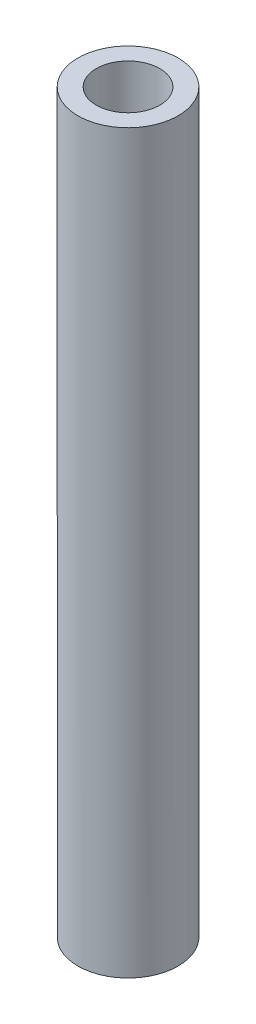
ISO-10303-21;
HEADER;
FILE_DESCRIPTION(('STEP AP214'),'2;1');
FILE_NAME('part.step','',(''),(''),'','','');
FILE_SCHEMA(('AUTOMOTIVE_DESIGN { 1 0 10303 214 1 1 1 1 }'));
ENDSEC;
DATA;
#1=APPLICATION_CONTEXT('core data for automotive mechanical design processes');
#2=APPLICATION_PROTOCOL_DEFINITION('international standard','automotive_design',2000,#1);
#3=PRODUCT_CONTEXT('',#1,'mechanical');
#4=PRODUCT('Part','Part','',(#3));
#5=PRODUCT_RELATED_PRODUCT_CATEGORY('part','',(#4));
#6=PRODUCT_DEFINITION_FORMATION('','',#4);
#7=PRODUCT_DEFINITION_CONTEXT('part definition',#1,'design');
#8=PRODUCT_DEFINITION('design','',#6,#7);
#9=PRODUCT_DEFINITION_SHAPE('','',#8);
#10=(LENGTH_UNIT() NAMED_UNIT(*) SI_UNIT(.MILLI.,.METRE.));
#11=(NAMED_UNIT(*) PLANE_ANGLE_UNIT() SI_UNIT($,.RADIAN.));
#12=(NAMED_UNIT(*) SI_UNIT($,.STERADIAN.) SOLID_ANGLE_UNIT());
#13=UNCERTAINTY_MEASURE_WITH_UNIT(LENGTH_MEASURE(1.E-05),#10,'distance_accuracy_value','');
#14=(GEOMETRIC_REPRESENTATION_CONTEXT(3) GLOBAL_UNCERTAINTY_ASSIGNED_CONTEXT((#13)) GLOBAL_UNIT_ASSIGNED_CONTEXT((#10,
#11,#12)) REPRESENTATION_CONTEXT('',''));
#15=CARTESIAN_POINT('',(0.,0.,0.));
#16=DIRECTION('',(0.,0.,1.));
#17=DIRECTION('',(1.,0.,0.));
#18=AXIS2_PLACEMENT_3D('',#15,#16,#17);
#19=CARTESIAN_POINT('',(0.,-65.,0.));
#20=DIRECTION('',(0.,1.,0.));
#21=DIRECTION('',(0.,0.,1.));
#22=AXIS2_PLACEMENT_3D('',#19,#20,#21);
#23=PLANE('',#22);
#24=CARTESIAN_POINT('',(0.,-65.,0.));
#25=DIRECTION('',(0.,1.,0.));
#26=DIRECTION('',(0.,0.,1.));
#27=AXIS2_PLACEMENT_3D('',#24,#25,#26);
#28=CIRCLE('',#27,4.7625);
#29=CARTESIAN_POINT('',(0.,-65.,4.7625));
#30=VERTEX_POINT('',#29);
#31=EDGE_CURVE('E10',#30,#30,#28,.T.);
#32=ORIENTED_EDGE('',*,*,#31,.F.);
#33=EDGE_LOOP('',(#32));
#34=FACE_BOUND('',#33,.T.);
#35=CARTESIAN_POINT('',(0.,-65.,0.));
#36=DIRECTION('',(0.,1.,0.));
#37=DIRECTION('',(0.,0.,1.));
#38=AXIS2_PLACEMENT_3D('',#35,#36,#37);
#39=CIRCLE('',#38,3.01897649096245);
#40=CARTESIAN_POINT('',(0.,-65.,3.01897649096245));
#41=VERTEX_POINT('',#40);
#42=EDGE_CURVE('E40',#41,#41,#39,.T.);
#43=ORIENTED_EDGE('',*,*,#42,.T.);
#44=EDGE_LOOP('',(#43));
#45=FACE_BOUND('',#44,.T.);
#46=ADVANCED_FACE('F32',(#34,#45),#23,.F.);
#47=CARTESIAN_POINT('',(0.,65.,0.));
#48=DIRECTION('',(0.,-1.,0.));
#49=DIRECTION('',(0.,0.,-1.));
#50=AXIS2_PLACEMENT_3D('',#47,#48,#49);
#51=CYLINDRICAL_SURFACE('',#50,4.7625);
#52=CARTESIAN_POINT('',(0.,5.,0.));
#53=DIRECTION('',(0.,-1.,0.));
#54=DIRECTION('',(0.,0.,-1.));
#55=AXIS2_PLACEMENT_3D('',#52,#53,#54);
#56=CIRCLE('',#55,4.7625);
#57=CARTESIAN_POINT('',(0.,5.00000000000001,-4.7625));
#58=VERTEX_POINT('',#57);
#59=EDGE_CURVE('E44',#58,#58,#56,.T.);
#60=ORIENTED_EDGE('',*,*,#59,.T.);
#61=EDGE_LOOP('',(#60));
#62=FACE_BOUND('',#61,.T.);
#63=ORIENTED_EDGE('',*,*,#31,.T.);
#64=EDGE_LOOP('',(#63));
#65=FACE_BOUND('',#64,.T.);
#66=ADVANCED_FACE('F34',(#62,#65),#51,.T.);
#67=CARTESIAN_POINT('',(0.,65.,0.));
#68=DIRECTION('',(0.,-1.,0.));
#69=DIRECTION('',(0.,0.,-1.));
#70=AXIS2_PLACEMENT_3D('',#67,#68,#69);
#71=CYLINDRICAL_SURFACE('',#70,3.01897649096245);
#72=CARTESIAN_POINT('',(0.,5.,0.));
#73=DIRECTION('',(0.,-1.,0.));
#74=DIRECTION('',(0.,0.,-1.));
#75=AXIS2_PLACEMENT_3D('',#72,#73,#74);
#76=CIRCLE('',#75,3.01897649096245);
#77=CARTESIAN_POINT('',(0.,5.,-3.01897649096245));
#78=VERTEX_POINT('',#77);
#79=EDGE_CURVE('E36',#78,#78,#76,.T.);
#80=ORIENTED_EDGE('',*,*,#79,.F.);
#81=EDGE_LOOP('',(#80));
#82=FACE_BOUND('',#81,.T.);
#83=ORIENTED_EDGE('',*,*,#42,.F.);
#84=EDGE_LOOP('',(#83));
#85=FACE_BOUND('',#84,.T.);
#86=ADVANCED_FACE('F56',(#82,#85),#71,.F.);
#87=CARTESIAN_POINT('',(-4.7625,5.,-15.5590167069306));
#88=DIRECTION('',(0.,-1.,0.));
#89=DIRECTION('',(0.,0.,-1.));
#90=AXIS2_PLACEMENT_3D('',#87,#88,#89);
#91=PLANE('',#90);
#92=ORIENTED_EDGE('',*,*,#79,.T.);
#93=EDGE_LOOP('',(#92));
#94=FACE_BOUND('',#93,.T.);
#95=ORIENTED_EDGE('',*,*,#59,.F.);
#96=EDGE_LOOP('',(#95));
#97=FACE_BOUND('',#96,.T.);
#98=ADVANCED_FACE('F53',(#94,#97),#91,.F.);
#99=CLOSED_SHELL('',(#46,#66,#86,#98));
#100=MANIFOLD_SOLID_BREP('B2',#99);
#101=ADVANCED_BREP_SHAPE_REPRESENTATION('',(#18,#100),#14);
#102=SHAPE_DEFINITION_REPRESENTATION(#9,#101);
ENDSEC;
END-ISO-10303-21;
